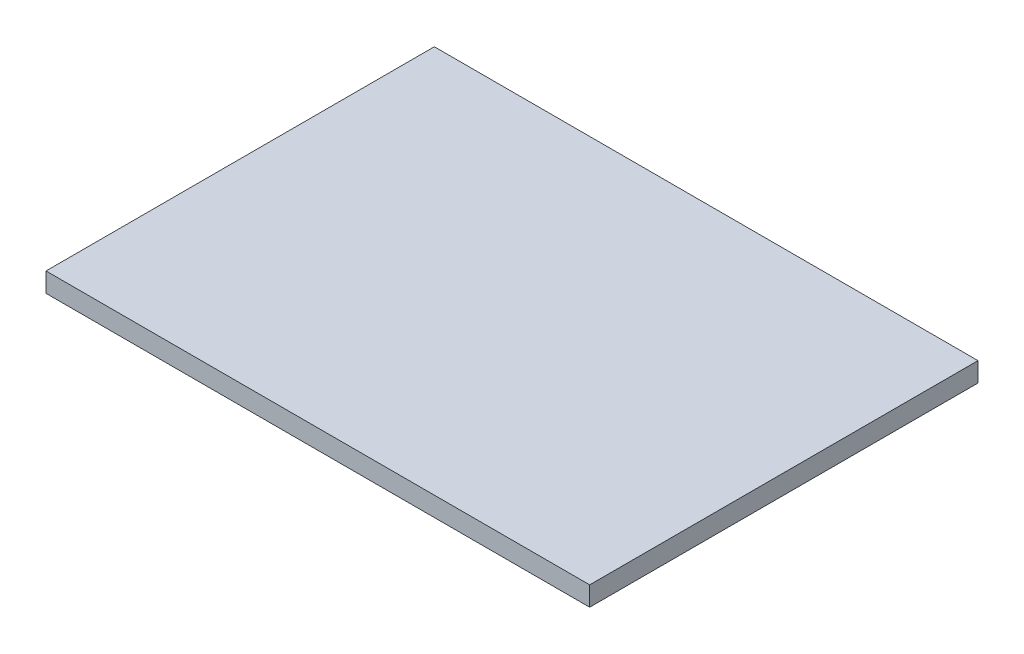
ISO-10303-21;
HEADER;
FILE_DESCRIPTION(('STEP AP214'),'2;1');
FILE_NAME('part.step','',(''),(''),'','','');
FILE_SCHEMA(('AUTOMOTIVE_DESIGN { 1 0 10303 214 1 1 1 1 }'));
ENDSEC;
DATA;
#1=APPLICATION_CONTEXT('core data for automotive mechanical design processes');
#2=APPLICATION_PROTOCOL_DEFINITION('international standard','automotive_design',2000,#1);
#3=PRODUCT_CONTEXT('',#1,'mechanical');
#4=PRODUCT('Part','Part','',(#3));
#5=PRODUCT_RELATED_PRODUCT_CATEGORY('part','',(#4));
#6=PRODUCT_DEFINITION_FORMATION('','',#4);
#7=PRODUCT_DEFINITION_CONTEXT('part definition',#1,'design');
#8=PRODUCT_DEFINITION('design','',#6,#7);
#9=PRODUCT_DEFINITION_SHAPE('','',#8);
#10=(LENGTH_UNIT() NAMED_UNIT(*) SI_UNIT(.MILLI.,.METRE.));
#11=(NAMED_UNIT(*) PLANE_ANGLE_UNIT() SI_UNIT($,.RADIAN.));
#12=(NAMED_UNIT(*) SI_UNIT($,.STERADIAN.) SOLID_ANGLE_UNIT());
#13=UNCERTAINTY_MEASURE_WITH_UNIT(LENGTH_MEASURE(1.E-05),#10,'distance_accuracy_value','');
#14=(GEOMETRIC_REPRESENTATION_CONTEXT(3) GLOBAL_UNCERTAINTY_ASSIGNED_CONTEXT((#13)) GLOBAL_UNIT_ASSIGNED_CONTEXT((#10,
#11,#12)) REPRESENTATION_CONTEXT('',''));
#15=CARTESIAN_POINT('',(0.,0.,0.));
#16=DIRECTION('',(0.,0.,1.));
#17=DIRECTION('',(1.,0.,0.));
#18=AXIS2_PLACEMENT_3D('',#15,#16,#17);
#19=CARTESIAN_POINT('',(70.,5.,-50.));
#20=DIRECTION('',(-1.,0.,0.));
#21=DIRECTION('',(0.,0.,1.));
#22=AXIS2_PLACEMENT_3D('',#19,#20,#21);
#23=PLANE('',#22);
#24=DIRECTION('',(0.,0.,-1.));
#25=VECTOR('',#24,1.);
#26=CARTESIAN_POINT('',(70.,0.,-50.));
#27=LINE('',#26,#25);
#28=CARTESIAN_POINT('',(70.,0.,50.));
#29=VERTEX_POINT('',#28);
#30=CARTESIAN_POINT('',(70.,0.,-50.));
#31=VERTEX_POINT('',#30);
#32=EDGE_CURVE('E104',#29,#31,#27,.T.);
#33=ORIENTED_EDGE('',*,*,#32,.T.);
#34=DIRECTION('',(0.,-1.,0.));
#35=VECTOR('',#34,1.);
#36=CARTESIAN_POINT('',(70.,5.,-50.));
#37=LINE('',#36,#35);
#38=CARTESIAN_POINT('',(70.,5.,-50.));
#39=VERTEX_POINT('',#38);
#40=EDGE_CURVE('E11',#39,#31,#37,.T.);
#41=ORIENTED_EDGE('',*,*,#40,.F.);
#42=DIRECTION('',(0.,0.,-1.));
#43=VECTOR('',#42,1.);
#44=CARTESIAN_POINT('',(70.,5.,-50.));
#45=LINE('',#44,#43);
#46=CARTESIAN_POINT('',(70.,5.,50.));
#47=VERTEX_POINT('',#46);
#48=EDGE_CURVE('E92',#47,#39,#45,.T.);
#49=ORIENTED_EDGE('',*,*,#48,.F.);
#50=DIRECTION('',(0.,-1.,0.));
#51=VECTOR('',#50,1.);
#52=CARTESIAN_POINT('',(70.,5.,50.));
#53=LINE('',#52,#51);
#54=EDGE_CURVE('E100',#47,#29,#53,.T.);
#55=ORIENTED_EDGE('',*,*,#54,.T.);
#56=EDGE_LOOP('',(#33,#41,#49,#55));
#57=FACE_BOUND('',#56,.T.);
#58=ADVANCED_FACE('F41',(#57),#23,.F.);
#59=CARTESIAN_POINT('',(-70.,5.,-50.));
#60=DIRECTION('',(0.,0.,1.));
#61=DIRECTION('',(1.,0.,0.));
#62=AXIS2_PLACEMENT_3D('',#59,#60,#61);
#63=PLANE('',#62);
#64=DIRECTION('',(-1.,0.,0.));
#65=VECTOR('',#64,1.);
#66=CARTESIAN_POINT('',(-70.,0.,-50.));
#67=LINE('',#66,#65);
#68=CARTESIAN_POINT('',(-70.,0.,-50.));
#69=VERTEX_POINT('',#68);
#70=EDGE_CURVE('E96',#31,#69,#67,.T.);
#71=ORIENTED_EDGE('',*,*,#70,.T.);
#72=DIRECTION('',(0.,-1.,0.));
#73=VECTOR('',#72,1.);
#74=CARTESIAN_POINT('',(-70.,5.,-50.));
#75=LINE('',#74,#73);
#76=CARTESIAN_POINT('',(-70.,5.,-50.));
#77=VERTEX_POINT('',#76);
#78=EDGE_CURVE('E49',#77,#69,#75,.T.);
#79=ORIENTED_EDGE('',*,*,#78,.F.);
#80=DIRECTION('',(-1.,0.,0.));
#81=VECTOR('',#80,1.);
#82=CARTESIAN_POINT('',(-70.,5.,-50.));
#83=LINE('',#82,#81);
#84=EDGE_CURVE('E87',#39,#77,#83,.T.);
#85=ORIENTED_EDGE('',*,*,#84,.F.);
#86=ORIENTED_EDGE('',*,*,#40,.T.);
#87=EDGE_LOOP('',(#71,#79,#85,#86));
#88=FACE_BOUND('',#87,.T.);
#89=ADVANCED_FACE('F95',(#88),#63,.F.);
#90=CARTESIAN_POINT('',(-70.,5.,-50.));
#91=DIRECTION('',(1.,0.,0.));
#92=DIRECTION('',(0.,0.,-1.));
#93=AXIS2_PLACEMENT_3D('',#90,#91,#92);
#94=PLANE('',#93);
#95=DIRECTION('',(0.,0.,1.));
#96=VECTOR('',#95,1.);
#97=CARTESIAN_POINT('',(-70.,0.,-50.));
#98=LINE('',#97,#96);
#99=CARTESIAN_POINT('',(-70.,0.,50.));
#100=VERTEX_POINT('',#99);
#101=EDGE_CURVE('E74',#69,#100,#98,.T.);
#102=ORIENTED_EDGE('',*,*,#101,.T.);
#103=DIRECTION('',(0.,-1.,0.));
#104=VECTOR('',#103,1.);
#105=CARTESIAN_POINT('',(-70.,5.,50.));
#106=LINE('',#105,#104);
#107=CARTESIAN_POINT('',(-70.,5.,50.));
#108=VERTEX_POINT('',#107);
#109=EDGE_CURVE('E97',#108,#100,#106,.T.);
#110=ORIENTED_EDGE('',*,*,#109,.F.);
#111=DIRECTION('',(0.,0.,1.));
#112=VECTOR('',#111,1.);
#113=CARTESIAN_POINT('',(-70.,5.,-50.));
#114=LINE('',#113,#112);
#115=EDGE_CURVE('E90',#77,#108,#114,.T.);
#116=ORIENTED_EDGE('',*,*,#115,.F.);
#117=ORIENTED_EDGE('',*,*,#78,.T.);
#118=EDGE_LOOP('',(#102,#110,#116,#117));
#119=FACE_BOUND('',#118,.T.);
#120=ADVANCED_FACE('F98',(#119),#94,.F.);
#121=CARTESIAN_POINT('',(-70.,5.,50.));
#122=DIRECTION('',(0.,0.,-1.));
#123=DIRECTION('',(-1.,0.,0.));
#124=AXIS2_PLACEMENT_3D('',#121,#122,#123);
#125=PLANE('',#124);
#126=DIRECTION('',(1.,0.,0.));
#127=VECTOR('',#126,1.);
#128=CARTESIAN_POINT('',(-70.,0.,50.));
#129=LINE('',#128,#127);
#130=EDGE_CURVE('E80',#100,#29,#129,.T.);
#131=ORIENTED_EDGE('',*,*,#130,.T.);
#132=ORIENTED_EDGE('',*,*,#54,.F.);
#133=DIRECTION('',(1.,0.,0.));
#134=VECTOR('',#133,1.);
#135=CARTESIAN_POINT('',(-70.,5.,50.));
#136=LINE('',#135,#134);
#137=EDGE_CURVE('E57',#108,#47,#136,.T.);
#138=ORIENTED_EDGE('',*,*,#137,.F.);
#139=ORIENTED_EDGE('',*,*,#109,.T.);
#140=EDGE_LOOP('',(#131,#132,#138,#139));
#141=FACE_BOUND('',#140,.T.);
#142=ADVANCED_FACE('F111',(#141),#125,.F.);
#143=CARTESIAN_POINT('',(0.,5.,0.));
#144=DIRECTION('',(0.,1.,0.));
#145=DIRECTION('',(0.,0.,1.));
#146=AXIS2_PLACEMENT_3D('',#143,#144,#145);
#147=PLANE('',#146);
#148=ORIENTED_EDGE('',*,*,#48,.T.);
#149=ORIENTED_EDGE('',*,*,#84,.T.);
#150=ORIENTED_EDGE('',*,*,#115,.T.);
#151=ORIENTED_EDGE('',*,*,#137,.T.);
#152=EDGE_LOOP('',(#148,#149,#150,#151));
#153=FACE_BOUND('',#152,.T.);
#154=ADVANCED_FACE('F88',(#153),#147,.T.);
#155=CARTESIAN_POINT('',(0.,0.,0.));
#156=DIRECTION('',(0.,1.,0.));
#157=DIRECTION('',(0.,0.,1.));
#158=AXIS2_PLACEMENT_3D('',#155,#156,#157);
#159=PLANE('',#158);
#160=ORIENTED_EDGE('',*,*,#32,.F.);
#161=ORIENTED_EDGE('',*,*,#130,.F.);
#162=ORIENTED_EDGE('',*,*,#101,.F.);
#163=ORIENTED_EDGE('',*,*,#70,.F.);
#164=EDGE_LOOP('',(#160,#161,#162,#163));
#165=FACE_BOUND('',#164,.T.);
#166=ADVANCED_FACE('F114',(#165),#159,.F.);
#167=CLOSED_SHELL('',(#58,#89,#120,#142,#154,#166));
#168=MANIFOLD_SOLID_BREP('B2',#167);
#169=ADVANCED_BREP_SHAPE_REPRESENTATION('',(#18,#168),#14);
#170=SHAPE_DEFINITION_REPRESENTATION(#9,#169);
ENDSEC;
END-ISO-10303-21;
